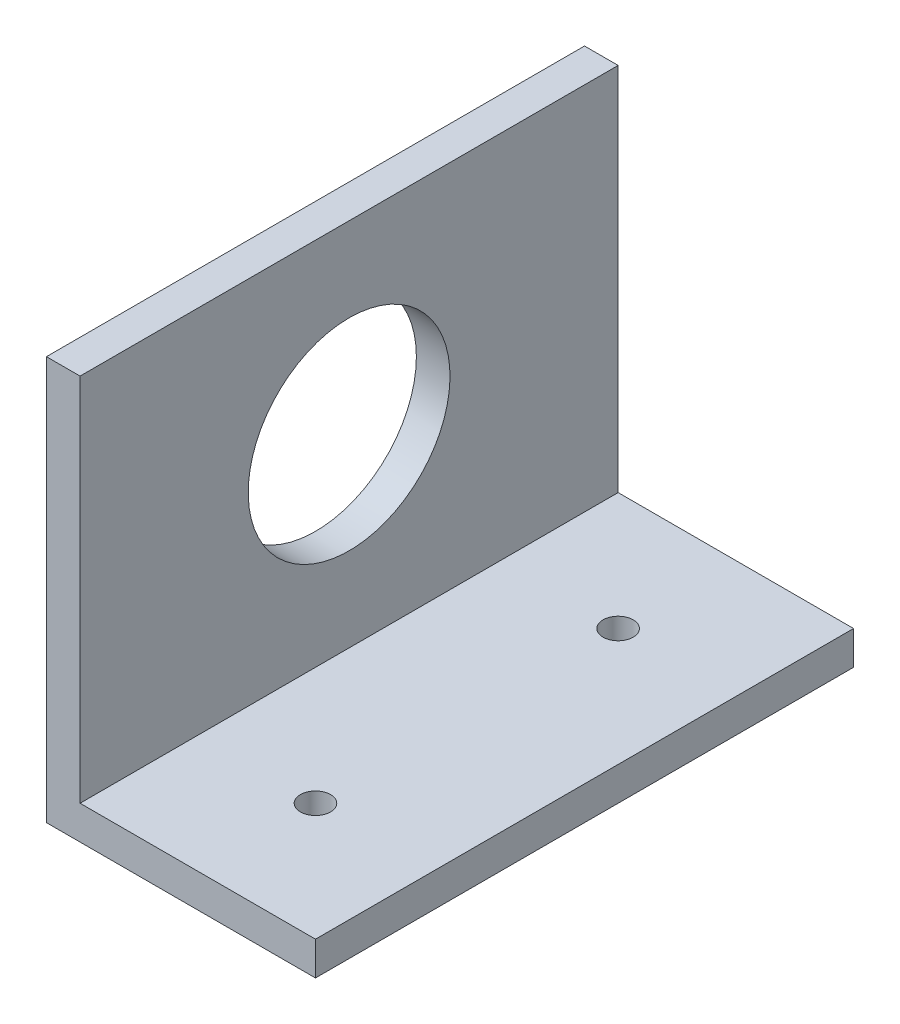
ISO-10303-21;
HEADER;
FILE_DESCRIPTION(('STEP AP214'),'2;1');
FILE_NAME('part.step','',(''),(''),'','','');
FILE_SCHEMA(('AUTOMOTIVE_DESIGN { 1 0 10303 214 1 1 1 1 }'));
ENDSEC;
DATA;
#1=APPLICATION_CONTEXT('core data for automotive mechanical design processes');
#2=APPLICATION_PROTOCOL_DEFINITION('international standard','automotive_design',2000,#1);
#3=PRODUCT_CONTEXT('',#1,'mechanical');
#4=PRODUCT('Part','Part','',(#3));
#5=PRODUCT_RELATED_PRODUCT_CATEGORY('part','',(#4));
#6=PRODUCT_DEFINITION_FORMATION('','',#4);
#7=PRODUCT_DEFINITION_CONTEXT('part definition',#1,'design');
#8=PRODUCT_DEFINITION('design','',#6,#7);
#9=PRODUCT_DEFINITION_SHAPE('','',#8);
#10=(LENGTH_UNIT() NAMED_UNIT(*) SI_UNIT(.MILLI.,.METRE.));
#11=(NAMED_UNIT(*) PLANE_ANGLE_UNIT() SI_UNIT($,.RADIAN.));
#12=(NAMED_UNIT(*) SI_UNIT($,.STERADIAN.) SOLID_ANGLE_UNIT());
#13=UNCERTAINTY_MEASURE_WITH_UNIT(LENGTH_MEASURE(1.E-05),#10,'distance_accuracy_value','');
#14=(GEOMETRIC_REPRESENTATION_CONTEXT(3) GLOBAL_UNCERTAINTY_ASSIGNED_CONTEXT((#13)) GLOBAL_UNIT_ASSIGNED_CONTEXT((#10,
#11,#12)) REPRESENTATION_CONTEXT('',''));
#15=CARTESIAN_POINT('',(0.,0.,0.));
#16=DIRECTION('',(0.,0.,1.));
#17=DIRECTION('',(1.,0.,0.));
#18=AXIS2_PLACEMENT_3D('',#15,#16,#17);
#19=CARTESIAN_POINT('',(25.4,3.175,50.8));
#20=DIRECTION('',(-1.,0.,0.));
#21=DIRECTION('',(0.,0.,1.));
#22=AXIS2_PLACEMENT_3D('',#19,#20,#21);
#23=PLANE('',#22);
#24=DIRECTION('',(0.,1.,0.));
#25=VECTOR('',#24,1.);
#26=CARTESIAN_POINT('',(25.4,3.175,0.));
#27=LINE('',#26,#25);
#28=CARTESIAN_POINT('',(25.4,0.,0.));
#29=VERTEX_POINT('',#28);
#30=CARTESIAN_POINT('',(25.4,3.175,0.));
#31=VERTEX_POINT('',#30);
#32=EDGE_CURVE('E119',#29,#31,#27,.T.);
#33=ORIENTED_EDGE('',*,*,#32,.T.);
#34=DIRECTION('',(0.,0.,-1.));
#35=VECTOR('',#34,1.);
#36=CARTESIAN_POINT('',(25.4,3.175,50.8));
#37=LINE('',#36,#35);
#38=CARTESIAN_POINT('',(25.4,3.175,50.8));
#39=VERTEX_POINT('',#38);
#40=EDGE_CURVE('E11',#39,#31,#37,.T.);
#41=ORIENTED_EDGE('',*,*,#40,.F.);
#42=DIRECTION('',(0.,1.,0.));
#43=VECTOR('',#42,1.);
#44=CARTESIAN_POINT('',(25.4,3.175,50.8));
#45=LINE('',#44,#43);
#46=CARTESIAN_POINT('',(25.4,0.,50.8));
#47=VERTEX_POINT('',#46);
#48=EDGE_CURVE('E129',#47,#39,#45,.T.);
#49=ORIENTED_EDGE('',*,*,#48,.F.);
#50=DIRECTION('',(0.,0.,-1.));
#51=VECTOR('',#50,1.);
#52=CARTESIAN_POINT('',(25.4,0.,50.8));
#53=LINE('',#52,#51);
#54=EDGE_CURVE('E115',#47,#29,#53,.T.);
#55=ORIENTED_EDGE('',*,*,#54,.T.);
#56=EDGE_LOOP('',(#33,#41,#49,#55));
#57=FACE_BOUND('',#56,.T.);
#58=ADVANCED_FACE('F34',(#57),#23,.F.);
#59=CARTESIAN_POINT('',(3.17500000000001,3.175,50.8));
#60=DIRECTION('',(0.,-1.,0.));
#61=DIRECTION('',(1.,0.,0.));
#62=AXIS2_PLACEMENT_3D('',#59,#60,#61);
#63=PLANE('',#62);
#64=CARTESIAN_POINT('',(14.2875,3.175,39.6875));
#65=DIRECTION('',(0.,1.,0.));
#66=DIRECTION('',(0.,0.,1.));
#67=AXIS2_PLACEMENT_3D('',#64,#65,#66);
#68=CIRCLE('',#67,1.4224);
#69=CARTESIAN_POINT('',(14.2875,3.175,41.1099));
#70=VERTEX_POINT('',#69);
#71=EDGE_CURVE('E242',#70,#70,#68,.T.);
#72=ORIENTED_EDGE('',*,*,#71,.F.);
#73=EDGE_LOOP('',(#72));
#74=FACE_BOUND('',#73,.T.);
#75=CARTESIAN_POINT('',(14.2875,3.175,11.1125));
#76=DIRECTION('',(0.,1.,0.));
#77=DIRECTION('',(0.,0.,1.));
#78=AXIS2_PLACEMENT_3D('',#75,#76,#77);
#79=CIRCLE('',#78,1.4224);
#80=CARTESIAN_POINT('',(14.2875,3.175,12.5349));
#81=VERTEX_POINT('',#80);
#82=EDGE_CURVE('E244',#81,#81,#79,.T.);
#83=ORIENTED_EDGE('',*,*,#82,.F.);
#84=EDGE_LOOP('',(#83));
#85=FACE_BOUND('',#84,.T.);
#86=DIRECTION('',(-1.,0.,0.));
#87=VECTOR('',#86,1.);
#88=CARTESIAN_POINT('',(3.17500000000001,3.175,0.));
#89=LINE('',#88,#87);
#90=CARTESIAN_POINT('',(3.17500000000001,3.175,0.));
#91=VERTEX_POINT('',#90);
#92=EDGE_CURVE('E122',#31,#91,#89,.T.);
#93=ORIENTED_EDGE('',*,*,#92,.T.);
#94=DIRECTION('',(0.,0.,-1.));
#95=VECTOR('',#94,1.);
#96=CARTESIAN_POINT('',(3.17500000000001,3.175,50.8));
#97=LINE('',#96,#95);
#98=CARTESIAN_POINT('',(3.17500000000001,3.175,50.8));
#99=VERTEX_POINT('',#98);
#100=EDGE_CURVE('E43',#99,#91,#97,.T.);
#101=ORIENTED_EDGE('',*,*,#100,.F.);
#102=DIRECTION('',(-1.,0.,0.));
#103=VECTOR('',#102,1.);
#104=CARTESIAN_POINT('',(3.17500000000001,3.175,50.8));
#105=LINE('',#104,#103);
#106=EDGE_CURVE('E88',#39,#99,#105,.T.);
#107=ORIENTED_EDGE('',*,*,#106,.F.);
#108=ORIENTED_EDGE('',*,*,#40,.T.);
#109=EDGE_LOOP('',(#93,#101,#107,#108));
#110=FACE_BOUND('',#109,.T.);
#111=ADVANCED_FACE('F158',(#74,#85,#110),#63,.F.);
#112=CARTESIAN_POINT('',(3.175,38.1,50.8));
#113=DIRECTION('',(-1.,0.,0.));
#114=DIRECTION('',(0.,-1.,0.));
#115=AXIS2_PLACEMENT_3D('',#112,#113,#114);
#116=PLANE('',#115);
#117=CARTESIAN_POINT('',(3.175,20.6375,25.4));
#118=DIRECTION('',(1.,0.,0.));
#119=DIRECTION('',(0.,1.,0.));
#120=AXIS2_PLACEMENT_3D('',#117,#118,#119);
#121=CIRCLE('',#120,9.525);
#122=CARTESIAN_POINT('',(3.175,30.1625,25.4));
#123=VERTEX_POINT('',#122);
#124=EDGE_CURVE('E250',#123,#123,#121,.T.);
#125=ORIENTED_EDGE('',*,*,#124,.F.);
#126=EDGE_LOOP('',(#125));
#127=FACE_BOUND('',#126,.T.);
#128=DIRECTION('',(0.,1.,0.));
#129=VECTOR('',#128,1.);
#130=CARTESIAN_POINT('',(3.175,38.1,0.));
#131=LINE('',#130,#129);
#132=CARTESIAN_POINT('',(3.175,38.1,0.));
#133=VERTEX_POINT('',#132);
#134=EDGE_CURVE('E124',#91,#133,#131,.T.);
#135=ORIENTED_EDGE('',*,*,#134,.T.);
#136=DIRECTION('',(0.,0.,-1.));
#137=VECTOR('',#136,1.);
#138=CARTESIAN_POINT('',(3.175,38.1,50.8));
#139=LINE('',#138,#137);
#140=CARTESIAN_POINT('',(3.175,38.1,50.8));
#141=VERTEX_POINT('',#140);
#142=EDGE_CURVE('E110',#141,#133,#139,.T.);
#143=ORIENTED_EDGE('',*,*,#142,.F.);
#144=DIRECTION('',(0.,1.,0.));
#145=VECTOR('',#144,1.);
#146=CARTESIAN_POINT('',(3.175,38.1,50.8));
#147=LINE('',#146,#145);
#148=EDGE_CURVE('E101',#99,#141,#147,.T.);
#149=ORIENTED_EDGE('',*,*,#148,.F.);
#150=ORIENTED_EDGE('',*,*,#100,.T.);
#151=EDGE_LOOP('',(#135,#143,#149,#150));
#152=FACE_BOUND('',#151,.T.);
#153=ADVANCED_FACE('F136',(#127,#152),#116,.F.);
#154=CARTESIAN_POINT('',(0.,38.1,50.8));
#155=DIRECTION('',(0.,-1.,0.));
#156=DIRECTION('',(0.,0.,-1.));
#157=AXIS2_PLACEMENT_3D('',#154,#155,#156);
#158=PLANE('',#157);
#159=DIRECTION('',(-1.,0.,0.));
#160=VECTOR('',#159,1.);
#161=CARTESIAN_POINT('',(0.,38.1,0.));
#162=LINE('',#161,#160);
#163=CARTESIAN_POINT('',(0.,38.1,0.));
#164=VERTEX_POINT('',#163);
#165=EDGE_CURVE('E109',#133,#164,#162,.T.);
#166=ORIENTED_EDGE('',*,*,#165,.T.);
#167=DIRECTION('',(0.,0.,-1.));
#168=VECTOR('',#167,1.);
#169=CARTESIAN_POINT('',(0.,38.1,50.8));
#170=LINE('',#169,#168);
#171=CARTESIAN_POINT('',(0.,38.1,50.8));
#172=VERTEX_POINT('',#171);
#173=EDGE_CURVE('E106',#172,#164,#170,.T.);
#174=ORIENTED_EDGE('',*,*,#173,.F.);
#175=DIRECTION('',(-1.,0.,0.));
#176=VECTOR('',#175,1.);
#177=CARTESIAN_POINT('',(0.,38.1,50.8));
#178=LINE('',#177,#176);
#179=EDGE_CURVE('E95',#141,#172,#178,.T.);
#180=ORIENTED_EDGE('',*,*,#179,.F.);
#181=ORIENTED_EDGE('',*,*,#142,.T.);
#182=EDGE_LOOP('',(#166,#174,#180,#181));
#183=FACE_BOUND('',#182,.T.);
#184=ADVANCED_FACE('F107',(#183),#158,.F.);
#185=CARTESIAN_POINT('',(0.,0.,50.8));
#186=DIRECTION('',(1.,0.,0.));
#187=DIRECTION('',(0.,0.,-1.));
#188=AXIS2_PLACEMENT_3D('',#185,#186,#187);
#189=PLANE('',#188);
#190=CARTESIAN_POINT('',(0.,20.6375,25.4));
#191=DIRECTION('',(1.,0.,0.));
#192=DIRECTION('',(0.,0.,-1.));
#193=AXIS2_PLACEMENT_3D('',#190,#191,#192);
#194=CIRCLE('',#193,9.525);
#195=CARTESIAN_POINT('',(0.,20.6375,15.875));
#196=VERTEX_POINT('',#195);
#197=EDGE_CURVE('E37',#196,#196,#194,.T.);
#198=ORIENTED_EDGE('',*,*,#197,.T.);
#199=EDGE_LOOP('',(#198));
#200=FACE_BOUND('',#199,.T.);
#201=DIRECTION('',(0.,-1.,0.));
#202=VECTOR('',#201,1.);
#203=CARTESIAN_POINT('',(0.,0.,0.));
#204=LINE('',#203,#202);
#205=CARTESIAN_POINT('',(0.,0.,0.));
#206=VERTEX_POINT('',#205);
#207=EDGE_CURVE('E74',#164,#206,#204,.T.);
#208=ORIENTED_EDGE('',*,*,#207,.T.);
#209=DIRECTION('',(0.,0.,-1.));
#210=VECTOR('',#209,1.);
#211=CARTESIAN_POINT('',(0.,0.,50.8));
#212=LINE('',#211,#210);
#213=CARTESIAN_POINT('',(0.,0.,50.8));
#214=VERTEX_POINT('',#213);
#215=EDGE_CURVE('E111',#214,#206,#212,.T.);
#216=ORIENTED_EDGE('',*,*,#215,.F.);
#217=DIRECTION('',(0.,-1.,0.));
#218=VECTOR('',#217,1.);
#219=CARTESIAN_POINT('',(0.,0.,50.8));
#220=LINE('',#219,#218);
#221=EDGE_CURVE('E99',#172,#214,#220,.T.);
#222=ORIENTED_EDGE('',*,*,#221,.F.);
#223=ORIENTED_EDGE('',*,*,#173,.T.);
#224=EDGE_LOOP('',(#208,#216,#222,#223));
#225=FACE_BOUND('',#224,.T.);
#226=ADVANCED_FACE('F113',(#200,#225),#189,.F.);
#227=CARTESIAN_POINT('',(25.4,0.,50.8));
#228=DIRECTION('',(0.,1.,0.));
#229=DIRECTION('',(-1.,0.,0.));
#230=AXIS2_PLACEMENT_3D('',#227,#228,#229);
#231=PLANE('',#230);
#232=CARTESIAN_POINT('',(14.2875,0.,39.6875));
#233=DIRECTION('',(0.,1.,0.));
#234=DIRECTION('',(0.,0.,1.));
#235=AXIS2_PLACEMENT_3D('',#232,#233,#234);
#236=CIRCLE('',#235,1.4224);
#237=CARTESIAN_POINT('',(14.2875,0.,41.1099));
#238=VERTEX_POINT('',#237);
#239=EDGE_CURVE('E240',#238,#238,#236,.T.);
#240=ORIENTED_EDGE('',*,*,#239,.T.);
#241=EDGE_LOOP('',(#240));
#242=FACE_BOUND('',#241,.T.);
#243=CARTESIAN_POINT('',(14.2875,0.,11.1125));
#244=DIRECTION('',(0.,1.,0.));
#245=DIRECTION('',(0.,0.,1.));
#246=AXIS2_PLACEMENT_3D('',#243,#244,#245);
#247=CIRCLE('',#246,1.4224);
#248=CARTESIAN_POINT('',(14.2875,0.,12.5349));
#249=VERTEX_POINT('',#248);
#250=EDGE_CURVE('E247',#249,#249,#247,.T.);
#251=ORIENTED_EDGE('',*,*,#250,.T.);
#252=EDGE_LOOP('',(#251));
#253=FACE_BOUND('',#252,.T.);
#254=DIRECTION('',(1.,0.,0.));
#255=VECTOR('',#254,1.);
#256=CARTESIAN_POINT('',(25.4,0.,0.));
#257=LINE('',#256,#255);
#258=EDGE_CURVE('E80',#206,#29,#257,.T.);
#259=ORIENTED_EDGE('',*,*,#258,.T.);
#260=ORIENTED_EDGE('',*,*,#54,.F.);
#261=DIRECTION('',(1.,0.,0.));
#262=VECTOR('',#261,1.);
#263=CARTESIAN_POINT('',(25.4,0.,50.8));
#264=LINE('',#263,#262);
#265=EDGE_CURVE('E51',#214,#47,#264,.T.);
#266=ORIENTED_EDGE('',*,*,#265,.F.);
#267=ORIENTED_EDGE('',*,*,#215,.T.);
#268=EDGE_LOOP('',(#259,#260,#266,#267));
#269=FACE_BOUND('',#268,.T.);
#270=ADVANCED_FACE('F143',(#242,#253,#269),#231,.F.);
#271=CARTESIAN_POINT('',(0.,0.,50.8));
#272=DIRECTION('',(0.,0.,-1.));
#273=DIRECTION('',(-1.,0.,0.));
#274=AXIS2_PLACEMENT_3D('',#271,#272,#273);
#275=PLANE('',#274);
#276=ORIENTED_EDGE('',*,*,#48,.T.);
#277=ORIENTED_EDGE('',*,*,#106,.T.);
#278=ORIENTED_EDGE('',*,*,#148,.T.);
#279=ORIENTED_EDGE('',*,*,#179,.T.);
#280=ORIENTED_EDGE('',*,*,#221,.T.);
#281=ORIENTED_EDGE('',*,*,#265,.T.);
#282=EDGE_LOOP('',(#276,#277,#278,#279,#280,#281));
#283=FACE_BOUND('',#282,.T.);
#284=ADVANCED_FACE('F97',(#283),#275,.F.);
#285=CARTESIAN_POINT('',(0.,0.,0.));
#286=DIRECTION('',(0.,0.,-1.));
#287=DIRECTION('',(-1.,0.,0.));
#288=AXIS2_PLACEMENT_3D('',#285,#286,#287);
#289=PLANE('',#288);
#290=ORIENTED_EDGE('',*,*,#32,.F.);
#291=ORIENTED_EDGE('',*,*,#258,.F.);
#292=ORIENTED_EDGE('',*,*,#207,.F.);
#293=ORIENTED_EDGE('',*,*,#165,.F.);
#294=ORIENTED_EDGE('',*,*,#134,.F.);
#295=ORIENTED_EDGE('',*,*,#92,.F.);
#296=EDGE_LOOP('',(#290,#291,#292,#293,#294,#295));
#297=FACE_BOUND('',#296,.T.);
#298=ADVANCED_FACE('F139',(#297),#289,.T.);
#299=CARTESIAN_POINT('',(-47.625,20.6375,25.4));
#300=DIRECTION('',(1.,0.,0.));
#301=DIRECTION('',(0.,1.,0.));
#302=AXIS2_PLACEMENT_3D('',#299,#300,#301);
#303=CYLINDRICAL_SURFACE('',#302,9.525);
#304=ORIENTED_EDGE('',*,*,#124,.T.);
#305=EDGE_LOOP('',(#304));
#306=FACE_BOUND('',#305,.T.);
#307=ORIENTED_EDGE('',*,*,#197,.F.);
#308=EDGE_LOOP('',(#307));
#309=FACE_BOUND('',#308,.T.);
#310=ADVANCED_FACE('F190',(#306,#309),#303,.F.);
#311=CARTESIAN_POINT('',(14.2875,0.,11.1125));
#312=DIRECTION('',(0.,1.,0.));
#313=DIRECTION('',(0.,0.,1.));
#314=AXIS2_PLACEMENT_3D('',#311,#312,#313);
#315=CYLINDRICAL_SURFACE('',#314,1.4224);
#316=ORIENTED_EDGE('',*,*,#250,.F.);
#317=EDGE_LOOP('',(#316));
#318=FACE_BOUND('',#317,.T.);
#319=ORIENTED_EDGE('',*,*,#82,.T.);
#320=EDGE_LOOP('',(#319));
#321=FACE_BOUND('',#320,.T.);
#322=ADVANCED_FACE('F194',(#318,#321),#315,.F.);
#323=CARTESIAN_POINT('',(14.2875,0.,39.6875));
#324=DIRECTION('',(0.,1.,0.));
#325=DIRECTION('',(0.,0.,1.));
#326=AXIS2_PLACEMENT_3D('',#323,#324,#325);
#327=CYLINDRICAL_SURFACE('',#326,1.4224);
#328=ORIENTED_EDGE('',*,*,#239,.F.);
#329=EDGE_LOOP('',(#328));
#330=FACE_BOUND('',#329,.T.);
#331=ORIENTED_EDGE('',*,*,#71,.T.);
#332=EDGE_LOOP('',(#331));
#333=FACE_BOUND('',#332,.T.);
#334=ADVANCED_FACE('F216',(#330,#333),#327,.F.);
#335=CLOSED_SHELL('',(#58,#111,#153,#184,#226,#270,#284,#298,#310,#322,#334));
#336=MANIFOLD_SOLID_BREP('B2',#335);
#337=ADVANCED_BREP_SHAPE_REPRESENTATION('',(#18,#336),#14);
#338=SHAPE_DEFINITION_REPRESENTATION(#9,#337);
ENDSEC;
END-ISO-10303-21;
